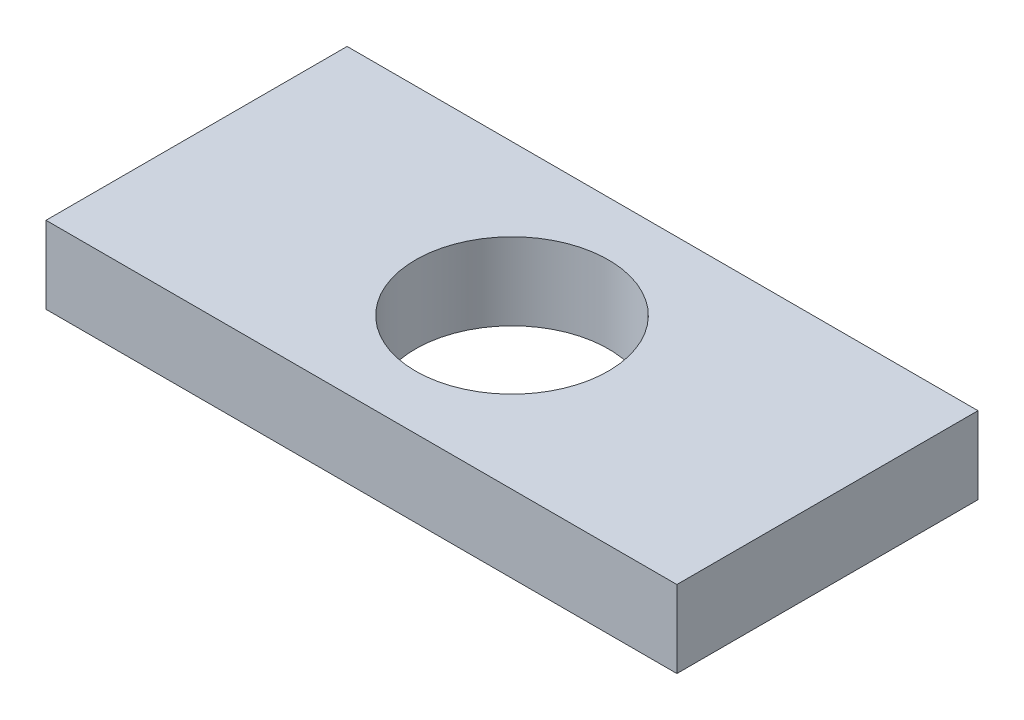
ISO-10303-21;
HEADER;
FILE_DESCRIPTION(('STEP AP214'),'2;1');
FILE_NAME('part.step','',(''),(''),'','','');
FILE_SCHEMA(('AUTOMOTIVE_DESIGN { 1 0 10303 214 1 1 1 1 }'));
ENDSEC;
DATA;
#1=APPLICATION_CONTEXT('core data for automotive mechanical design processes');
#2=APPLICATION_PROTOCOL_DEFINITION('international standard','automotive_design',2000,#1);
#3=PRODUCT_CONTEXT('',#1,'mechanical');
#4=PRODUCT('Part','Part','',(#3));
#5=PRODUCT_RELATED_PRODUCT_CATEGORY('part','',(#4));
#6=PRODUCT_DEFINITION_FORMATION('','',#4);
#7=PRODUCT_DEFINITION_CONTEXT('part definition',#1,'design');
#8=PRODUCT_DEFINITION('design','',#6,#7);
#9=PRODUCT_DEFINITION_SHAPE('','',#8);
#10=(LENGTH_UNIT() NAMED_UNIT(*) SI_UNIT(.MILLI.,.METRE.));
#11=(NAMED_UNIT(*) PLANE_ANGLE_UNIT() SI_UNIT($,.RADIAN.));
#12=(NAMED_UNIT(*) SI_UNIT($,.STERADIAN.) SOLID_ANGLE_UNIT());
#13=UNCERTAINTY_MEASURE_WITH_UNIT(LENGTH_MEASURE(1.E-05),#10,'distance_accuracy_value','');
#14=(GEOMETRIC_REPRESENTATION_CONTEXT(3) GLOBAL_UNCERTAINTY_ASSIGNED_CONTEXT((#13)) GLOBAL_UNIT_ASSIGNED_CONTEXT((#10,
#11,#12)) REPRESENTATION_CONTEXT('',''));
#15=CARTESIAN_POINT('',(0.,0.,0.));
#16=DIRECTION('',(0.,0.,1.));
#17=DIRECTION('',(1.,0.,0.));
#18=AXIS2_PLACEMENT_3D('',#15,#16,#17);
#19=CARTESIAN_POINT('',(0.,10.16,0.));
#20=DIRECTION('',(0.,-1.,0.));
#21=DIRECTION('',(0.,0.,-1.));
#22=AXIS2_PLACEMENT_3D('',#19,#20,#21);
#23=PLANE('',#22);
#24=DIRECTION('',(0.,0.,-1.));
#25=VECTOR('',#24,1.);
#26=CARTESIAN_POINT('',(41.5522390039567,10.16,19.8317504337066));
#27=LINE('',#26,#25);
#28=CARTESIAN_POINT('',(41.5522390039567,10.16,19.8317504337066));
#29=VERTEX_POINT('',#28);
#30=CARTESIAN_POINT('',(41.5522390039567,10.16,-19.8317504337066));
#31=VERTEX_POINT('',#30);
#32=EDGE_CURVE('E92',#29,#31,#27,.T.);
#33=ORIENTED_EDGE('',*,*,#32,.T.);
#34=DIRECTION('',(-1.,0.,0.));
#35=VECTOR('',#34,1.);
#36=CARTESIAN_POINT('',(-41.5522390039567,10.16,-19.8317504337066));
#37=LINE('',#36,#35);
#38=CARTESIAN_POINT('',(-41.5522390039567,10.16,-19.8317504337066));
#39=VERTEX_POINT('',#38);
#40=EDGE_CURVE('E87',#31,#39,#37,.T.);
#41=ORIENTED_EDGE('',*,*,#40,.T.);
#42=DIRECTION('',(0.,0.,1.));
#43=VECTOR('',#42,1.);
#44=CARTESIAN_POINT('',(-41.5522390039567,10.16,19.8317504337066));
#45=LINE('',#44,#43);
#46=CARTESIAN_POINT('',(-41.5522390039567,10.16,19.8317504337066));
#47=VERTEX_POINT('',#46);
#48=EDGE_CURVE('E90',#39,#47,#45,.T.);
#49=ORIENTED_EDGE('',*,*,#48,.T.);
#50=DIRECTION('',(1.,0.,0.));
#51=VECTOR('',#50,1.);
#52=CARTESIAN_POINT('',(-41.5522390039567,10.16,19.8317504337066));
#53=LINE('',#52,#51);
#54=EDGE_CURVE('E57',#47,#29,#53,.T.);
#55=ORIENTED_EDGE('',*,*,#54,.T.);
#56=EDGE_LOOP('',(#33,#41,#49,#55));
#57=FACE_BOUND('',#56,.T.);
#58=CARTESIAN_POINT('',(0.,10.16,0.));
#59=DIRECTION('',(0.,1.,0.));
#60=DIRECTION('',(0.,0.,1.));
#61=AXIS2_PLACEMENT_3D('',#58,#59,#60);
#62=CIRCLE('',#61,12.7);
#63=CARTESIAN_POINT('',(0.,10.16,12.7));
#64=VERTEX_POINT('',#63);
#65=EDGE_CURVE('E112',#64,#64,#62,.T.);
#66=ORIENTED_EDGE('',*,*,#65,.F.);
#67=EDGE_LOOP('',(#66));
#68=FACE_BOUND('',#67,.T.);
#69=ADVANCED_FACE('F39',(#57,#68),#23,.F.);
#70=CARTESIAN_POINT('',(0.,0.,0.));
#71=DIRECTION('',(0.,-1.,0.));
#72=DIRECTION('',(0.,0.,-1.));
#73=AXIS2_PLACEMENT_3D('',#70,#71,#72);
#74=PLANE('',#73);
#75=DIRECTION('',(0.,0.,-1.));
#76=VECTOR('',#75,1.);
#77=CARTESIAN_POINT('',(41.5522390039567,0.,19.8317504337066));
#78=LINE('',#77,#76);
#79=CARTESIAN_POINT('',(41.5522390039567,0.,19.8317504337066));
#80=VERTEX_POINT('',#79);
#81=CARTESIAN_POINT('',(41.5522390039567,0.,-19.8317504337066));
#82=VERTEX_POINT('',#81);
#83=EDGE_CURVE('E108',#80,#82,#78,.T.);
#84=ORIENTED_EDGE('',*,*,#83,.F.);
#85=DIRECTION('',(1.,0.,0.));
#86=VECTOR('',#85,1.);
#87=CARTESIAN_POINT('',(-41.5522390039567,0.,19.8317504337066));
#88=LINE('',#87,#86);
#89=CARTESIAN_POINT('',(-41.5522390039567,0.,19.8317504337066));
#90=VERTEX_POINT('',#89);
#91=EDGE_CURVE('E80',#90,#80,#88,.T.);
#92=ORIENTED_EDGE('',*,*,#91,.F.);
#93=DIRECTION('',(0.,0.,1.));
#94=VECTOR('',#93,1.);
#95=CARTESIAN_POINT('',(-41.5522390039567,0.,19.8317504337066));
#96=LINE('',#95,#94);
#97=CARTESIAN_POINT('',(-41.5522390039567,0.,-19.8317504337066));
#98=VERTEX_POINT('',#97);
#99=EDGE_CURVE('E74',#98,#90,#96,.T.);
#100=ORIENTED_EDGE('',*,*,#99,.F.);
#101=DIRECTION('',(-1.,0.,0.));
#102=VECTOR('',#101,1.);
#103=CARTESIAN_POINT('',(-41.5522390039567,0.,-19.8317504337066));
#104=LINE('',#103,#102);
#105=EDGE_CURVE('E97',#82,#98,#104,.T.);
#106=ORIENTED_EDGE('',*,*,#105,.F.);
#107=EDGE_LOOP('',(#84,#92,#100,#106));
#108=FACE_BOUND('',#107,.T.);
#109=CARTESIAN_POINT('',(0.,0.,0.));
#110=DIRECTION('',(0.,1.,0.));
#111=DIRECTION('',(0.,0.,1.));
#112=AXIS2_PLACEMENT_3D('',#109,#110,#111);
#113=CIRCLE('',#112,12.7);
#114=CARTESIAN_POINT('',(0.,0.,12.7));
#115=VERTEX_POINT('',#114);
#116=EDGE_CURVE('E130',#115,#115,#113,.T.);
#117=ORIENTED_EDGE('',*,*,#116,.T.);
#118=EDGE_LOOP('',(#117));
#119=FACE_BOUND('',#118,.T.);
#120=ADVANCED_FACE('F125',(#108,#119),#74,.T.);
#121=CARTESIAN_POINT('',(41.5522390039567,10.16,19.8317504337066));
#122=DIRECTION('',(-1.,0.,0.));
#123=DIRECTION('',(0.,0.,1.));
#124=AXIS2_PLACEMENT_3D('',#121,#122,#123);
#125=PLANE('',#124);
#126=ORIENTED_EDGE('',*,*,#83,.T.);
#127=DIRECTION('',(0.,-1.,0.));
#128=VECTOR('',#127,1.);
#129=CARTESIAN_POINT('',(41.5522390039567,10.16,-19.8317504337066));
#130=LINE('',#129,#128);
#131=EDGE_CURVE('E11',#31,#82,#130,.T.);
#132=ORIENTED_EDGE('',*,*,#131,.F.);
#133=ORIENTED_EDGE('',*,*,#32,.F.);
#134=DIRECTION('',(0.,-1.,0.));
#135=VECTOR('',#134,1.);
#136=CARTESIAN_POINT('',(41.5522390039567,10.16,19.8317504337066));
#137=LINE('',#136,#135);
#138=EDGE_CURVE('E104',#29,#80,#137,.T.);
#139=ORIENTED_EDGE('',*,*,#138,.T.);
#140=EDGE_LOOP('',(#126,#132,#133,#139));
#141=FACE_BOUND('',#140,.T.);
#142=ADVANCED_FACE('F41',(#141),#125,.F.);
#143=CARTESIAN_POINT('',(-41.5522390039567,10.16,-19.8317504337066));
#144=DIRECTION('',(0.,0.,1.));
#145=DIRECTION('',(1.,0.,0.));
#146=AXIS2_PLACEMENT_3D('',#143,#144,#145);
#147=PLANE('',#146);
#148=ORIENTED_EDGE('',*,*,#105,.T.);
#149=DIRECTION('',(0.,-1.,0.));
#150=VECTOR('',#149,1.);
#151=CARTESIAN_POINT('',(-41.5522390039567,10.16,-19.8317504337066));
#152=LINE('',#151,#150);
#153=EDGE_CURVE('E49',#39,#98,#152,.T.);
#154=ORIENTED_EDGE('',*,*,#153,.F.);
#155=ORIENTED_EDGE('',*,*,#40,.F.);
#156=ORIENTED_EDGE('',*,*,#131,.T.);
#157=EDGE_LOOP('',(#148,#154,#155,#156));
#158=FACE_BOUND('',#157,.T.);
#159=ADVANCED_FACE('F96',(#158),#147,.F.);
#160=CARTESIAN_POINT('',(-41.5522390039567,10.16,19.8317504337066));
#161=DIRECTION('',(1.,0.,0.));
#162=DIRECTION('',(0.,0.,-1.));
#163=AXIS2_PLACEMENT_3D('',#160,#161,#162);
#164=PLANE('',#163);
#165=ORIENTED_EDGE('',*,*,#99,.T.);
#166=DIRECTION('',(0.,-1.,0.));
#167=VECTOR('',#166,1.);
#168=CARTESIAN_POINT('',(-41.5522390039567,10.16,19.8317504337066));
#169=LINE('',#168,#167);
#170=EDGE_CURVE('E99',#47,#90,#169,.T.);
#171=ORIENTED_EDGE('',*,*,#170,.F.);
#172=ORIENTED_EDGE('',*,*,#48,.F.);
#173=ORIENTED_EDGE('',*,*,#153,.T.);
#174=EDGE_LOOP('',(#165,#171,#172,#173));
#175=FACE_BOUND('',#174,.T.);
#176=ADVANCED_FACE('F100',(#175),#164,.F.);
#177=CARTESIAN_POINT('',(-41.5522390039567,10.16,19.8317504337066));
#178=DIRECTION('',(0.,0.,-1.));
#179=DIRECTION('',(-1.,0.,0.));
#180=AXIS2_PLACEMENT_3D('',#177,#178,#179);
#181=PLANE('',#180);
#182=ORIENTED_EDGE('',*,*,#91,.T.);
#183=ORIENTED_EDGE('',*,*,#138,.F.);
#184=ORIENTED_EDGE('',*,*,#54,.F.);
#185=ORIENTED_EDGE('',*,*,#170,.T.);
#186=EDGE_LOOP('',(#182,#183,#184,#185));
#187=FACE_BOUND('',#186,.T.);
#188=ADVANCED_FACE('F122',(#187),#181,.F.);
#189=CARTESIAN_POINT('',(0.,10.16,0.));
#190=DIRECTION('',(0.,-1.,0.));
#191=DIRECTION('',(0.,0.,-1.));
#192=AXIS2_PLACEMENT_3D('',#189,#190,#191);
#193=CYLINDRICAL_SURFACE('',#192,12.7);
#194=ORIENTED_EDGE('',*,*,#65,.T.);
#195=EDGE_LOOP('',(#194));
#196=FACE_BOUND('',#195,.T.);
#197=ORIENTED_EDGE('',*,*,#116,.F.);
#198=EDGE_LOOP('',(#197));
#199=FACE_BOUND('',#198,.T.);
#200=ADVANCED_FACE('F138',(#196,#199),#193,.F.);
#201=CLOSED_SHELL('',(#69,#120,#142,#159,#176,#188,#200));
#202=MANIFOLD_SOLID_BREP('B2',#201);
#203=ADVANCED_BREP_SHAPE_REPRESENTATION('',(#18,#202),#14);
#204=SHAPE_DEFINITION_REPRESENTATION(#9,#203);
ENDSEC;
END-ISO-10303-21;
